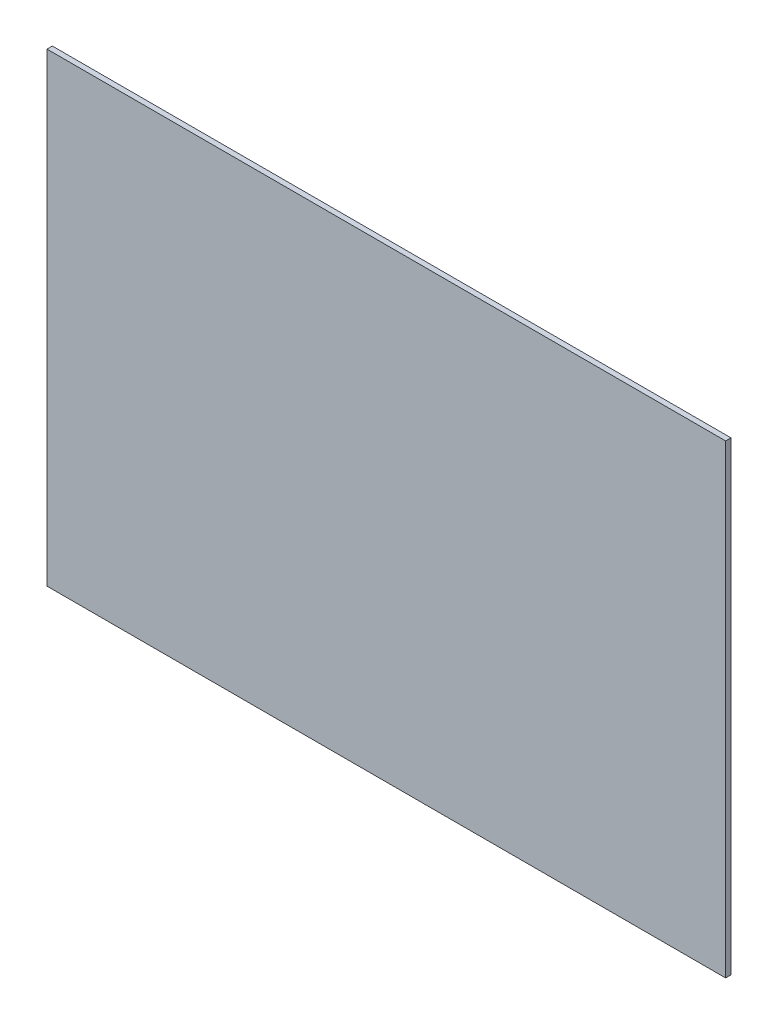
ISO-10303-21;
HEADER;
FILE_DESCRIPTION(('STEP AP214'),'2;1');
FILE_NAME('part.step','',(''),(''),'','','');
FILE_SCHEMA(('AUTOMOTIVE_DESIGN { 1 0 10303 214 1 1 1 1 }'));
ENDSEC;
DATA;
#1=APPLICATION_CONTEXT('core data for automotive mechanical design processes');
#2=APPLICATION_PROTOCOL_DEFINITION('international standard','automotive_design',2000,#1);
#3=PRODUCT_CONTEXT('',#1,'mechanical');
#4=PRODUCT('Part','Part','',(#3));
#5=PRODUCT_RELATED_PRODUCT_CATEGORY('part','',(#4));
#6=PRODUCT_DEFINITION_FORMATION('','',#4);
#7=PRODUCT_DEFINITION_CONTEXT('part definition',#1,'design');
#8=PRODUCT_DEFINITION('design','',#6,#7);
#9=PRODUCT_DEFINITION_SHAPE('','',#8);
#10=(LENGTH_UNIT() NAMED_UNIT(*) SI_UNIT(.MILLI.,.METRE.));
#11=(NAMED_UNIT(*) PLANE_ANGLE_UNIT() SI_UNIT($,.RADIAN.));
#12=(NAMED_UNIT(*) SI_UNIT($,.STERADIAN.) SOLID_ANGLE_UNIT());
#13=UNCERTAINTY_MEASURE_WITH_UNIT(LENGTH_MEASURE(1.E-05),#10,'distance_accuracy_value','');
#14=(GEOMETRIC_REPRESENTATION_CONTEXT(3) GLOBAL_UNCERTAINTY_ASSIGNED_CONTEXT((#13)) GLOBAL_UNIT_ASSIGNED_CONTEXT((#10,
#11,#12)) REPRESENTATION_CONTEXT('',''));
#15=CARTESIAN_POINT('',(0.,0.,0.));
#16=DIRECTION('',(0.,0.,1.));
#17=DIRECTION('',(1.,0.,0.));
#18=AXIS2_PLACEMENT_3D('',#15,#16,#17);
#19=CARTESIAN_POINT('',(-124.874516075228,0.,2.54));
#20=DIRECTION('',(1.,0.,0.));
#21=DIRECTION('',(0.,1.,0.));
#22=AXIS2_PLACEMENT_3D('',#19,#20,#21);
#23=PLANE('',#22);
#24=DIRECTION('',(0.,-1.,0.));
#25=VECTOR('',#24,1.);
#26=CARTESIAN_POINT('',(-124.874516075228,0.,0.));
#27=LINE('',#26,#25);
#28=CARTESIAN_POINT('',(-124.874516075228,31.46751193397,0.));
#29=VERTEX_POINT('',#28);
#30=CARTESIAN_POINT('',(-124.874516075228,-189.76648806603,0.));
#31=VERTEX_POINT('',#30);
#32=EDGE_CURVE('E111',#29,#31,#27,.T.);
#33=ORIENTED_EDGE('',*,*,#32,.T.);
#34=DIRECTION('',(0.,0.,-1.));
#35=VECTOR('',#34,1.);
#36=CARTESIAN_POINT('',(-124.874516075228,-189.76648806603,2.54));
#37=LINE('',#36,#35);
#38=CARTESIAN_POINT('',(-124.874516075228,-189.76648806603,2.54));
#39=VERTEX_POINT('',#38);
#40=EDGE_CURVE('E11',#39,#31,#37,.T.);
#41=ORIENTED_EDGE('',*,*,#40,.F.);
#42=DIRECTION('',(0.,-1.,0.));
#43=VECTOR('',#42,1.);
#44=CARTESIAN_POINT('',(-124.874516075228,0.,2.54));
#45=LINE('',#44,#43);
#46=CARTESIAN_POINT('',(-124.874516075228,31.46751193397,2.54));
#47=VERTEX_POINT('',#46);
#48=EDGE_CURVE('E93',#47,#39,#45,.T.);
#49=ORIENTED_EDGE('',*,*,#48,.F.);
#50=DIRECTION('',(0.,0.,-1.));
#51=VECTOR('',#50,1.);
#52=CARTESIAN_POINT('',(-124.874516075228,31.46751193397,2.54));
#53=LINE('',#52,#51);
#54=EDGE_CURVE('E60',#47,#29,#53,.T.);
#55=ORIENTED_EDGE('',*,*,#54,.T.);
#56=EDGE_LOOP('',(#33,#41,#49,#55));
#57=FACE_BOUND('',#56,.T.);
#58=ADVANCED_FACE('F43',(#57),#23,.F.);
#59=CARTESIAN_POINT('',(0.,-189.76648806603,2.54));
#60=DIRECTION('',(0.,1.,0.));
#61=DIRECTION('',(0.,0.,1.));
#62=AXIS2_PLACEMENT_3D('',#59,#60,#61);
#63=PLANE('',#62);
#64=DIRECTION('',(1.,0.,0.));
#65=VECTOR('',#64,1.);
#66=CARTESIAN_POINT('',(0.,-189.76648806603,0.));
#67=LINE('',#66,#65);
#68=CARTESIAN_POINT('',(197.959483924772,-189.76648806603,0.));
#69=VERTEX_POINT('',#68);
#70=EDGE_CURVE('E99',#31,#69,#67,.T.);
#71=ORIENTED_EDGE('',*,*,#70,.T.);
#72=DIRECTION('',(0.,0.,-1.));
#73=VECTOR('',#72,1.);
#74=CARTESIAN_POINT('',(197.959483924772,-189.76648806603,2.54));
#75=LINE('',#74,#73);
#76=CARTESIAN_POINT('',(197.959483924772,-189.76648806603,2.54));
#77=VERTEX_POINT('',#76);
#78=EDGE_CURVE('E52',#77,#69,#75,.T.);
#79=ORIENTED_EDGE('',*,*,#78,.F.);
#80=DIRECTION('',(1.,0.,0.));
#81=VECTOR('',#80,1.);
#82=CARTESIAN_POINT('',(0.,-189.76648806603,2.54));
#83=LINE('',#82,#81);
#84=EDGE_CURVE('E85',#39,#77,#83,.T.);
#85=ORIENTED_EDGE('',*,*,#84,.F.);
#86=ORIENTED_EDGE('',*,*,#40,.T.);
#87=EDGE_LOOP('',(#71,#79,#85,#86));
#88=FACE_BOUND('',#87,.T.);
#89=ADVANCED_FACE('F98',(#88),#63,.F.);
#90=CARTESIAN_POINT('',(197.959483924772,0.,2.54));
#91=DIRECTION('',(1.,0.,0.));
#92=DIRECTION('',(0.,1.,0.));
#93=AXIS2_PLACEMENT_3D('',#90,#91,#92);
#94=PLANE('',#93);
#95=DIRECTION('',(0.,-1.,0.));
#96=VECTOR('',#95,1.);
#97=CARTESIAN_POINT('',(197.959483924772,0.,0.));
#98=LINE('',#97,#96);
#99=CARTESIAN_POINT('',(197.959483924772,31.46751193397,0.));
#100=VERTEX_POINT('',#99);
#101=EDGE_CURVE('E116',#100,#69,#98,.T.);
#102=ORIENTED_EDGE('',*,*,#101,.F.);
#103=DIRECTION('',(0.,0.,-1.));
#104=VECTOR('',#103,1.);
#105=CARTESIAN_POINT('',(197.959483924772,31.46751193397,2.54));
#106=LINE('',#105,#104);
#107=CARTESIAN_POINT('',(197.959483924772,31.46751193397,2.54));
#108=VERTEX_POINT('',#107);
#109=EDGE_CURVE('E74',#108,#100,#106,.T.);
#110=ORIENTED_EDGE('',*,*,#109,.F.);
#111=DIRECTION('',(0.,-1.,0.));
#112=VECTOR('',#111,1.);
#113=CARTESIAN_POINT('',(197.959483924772,0.,2.54));
#114=LINE('',#113,#112);
#115=EDGE_CURVE('E92',#108,#77,#114,.T.);
#116=ORIENTED_EDGE('',*,*,#115,.T.);
#117=ORIENTED_EDGE('',*,*,#78,.T.);
#118=EDGE_LOOP('',(#102,#110,#116,#117));
#119=FACE_BOUND('',#118,.T.);
#120=ADVANCED_FACE('F103',(#119),#94,.T.);
#121=CARTESIAN_POINT('',(0.,31.46751193397,2.54));
#122=DIRECTION('',(0.,1.,0.));
#123=DIRECTION('',(0.,0.,1.));
#124=AXIS2_PLACEMENT_3D('',#121,#122,#123);
#125=PLANE('',#124);
#126=DIRECTION('',(1.,0.,0.));
#127=VECTOR('',#126,1.);
#128=CARTESIAN_POINT('',(0.,31.46751193397,0.));
#129=LINE('',#128,#127);
#130=EDGE_CURVE('E119',#29,#100,#129,.T.);
#131=ORIENTED_EDGE('',*,*,#130,.F.);
#132=ORIENTED_EDGE('',*,*,#54,.F.);
#133=DIRECTION('',(1.,0.,0.));
#134=VECTOR('',#133,1.);
#135=CARTESIAN_POINT('',(0.,31.46751193397,2.54));
#136=LINE('',#135,#134);
#137=EDGE_CURVE('E105',#47,#108,#136,.T.);
#138=ORIENTED_EDGE('',*,*,#137,.T.);
#139=ORIENTED_EDGE('',*,*,#109,.T.);
#140=EDGE_LOOP('',(#131,#132,#138,#139));
#141=FACE_BOUND('',#140,.T.);
#142=ADVANCED_FACE('F129',(#141),#125,.T.);
#143=CARTESIAN_POINT('',(0.,0.,2.54));
#144=DIRECTION('',(0.,0.,1.));
#145=DIRECTION('',(1.,0.,0.));
#146=AXIS2_PLACEMENT_3D('',#143,#144,#145);
#147=PLANE('',#146);
#148=ORIENTED_EDGE('',*,*,#48,.T.);
#149=ORIENTED_EDGE('',*,*,#84,.T.);
#150=ORIENTED_EDGE('',*,*,#115,.F.);
#151=ORIENTED_EDGE('',*,*,#137,.F.);
#152=EDGE_LOOP('',(#148,#149,#150,#151));
#153=FACE_BOUND('',#152,.T.);
#154=ADVANCED_FACE('F89',(#153),#147,.T.);
#155=CARTESIAN_POINT('',(0.,0.,0.));
#156=DIRECTION('',(0.,0.,1.));
#157=DIRECTION('',(1.,0.,0.));
#158=AXIS2_PLACEMENT_3D('',#155,#156,#157);
#159=PLANE('',#158);
#160=ORIENTED_EDGE('',*,*,#32,.F.);
#161=ORIENTED_EDGE('',*,*,#130,.T.);
#162=ORIENTED_EDGE('',*,*,#101,.T.);
#163=ORIENTED_EDGE('',*,*,#70,.F.);
#164=EDGE_LOOP('',(#160,#161,#162,#163));
#165=FACE_BOUND('',#164,.T.);
#166=ADVANCED_FACE('F128',(#165),#159,.F.);
#167=CLOSED_SHELL('',(#58,#89,#120,#142,#154,#166));
#168=MANIFOLD_SOLID_BREP('B2',#167);
#169=ADVANCED_BREP_SHAPE_REPRESENTATION('',(#18,#168),#14);
#170=SHAPE_DEFINITION_REPRESENTATION(#9,#169);
ENDSEC;
END-ISO-10303-21;
